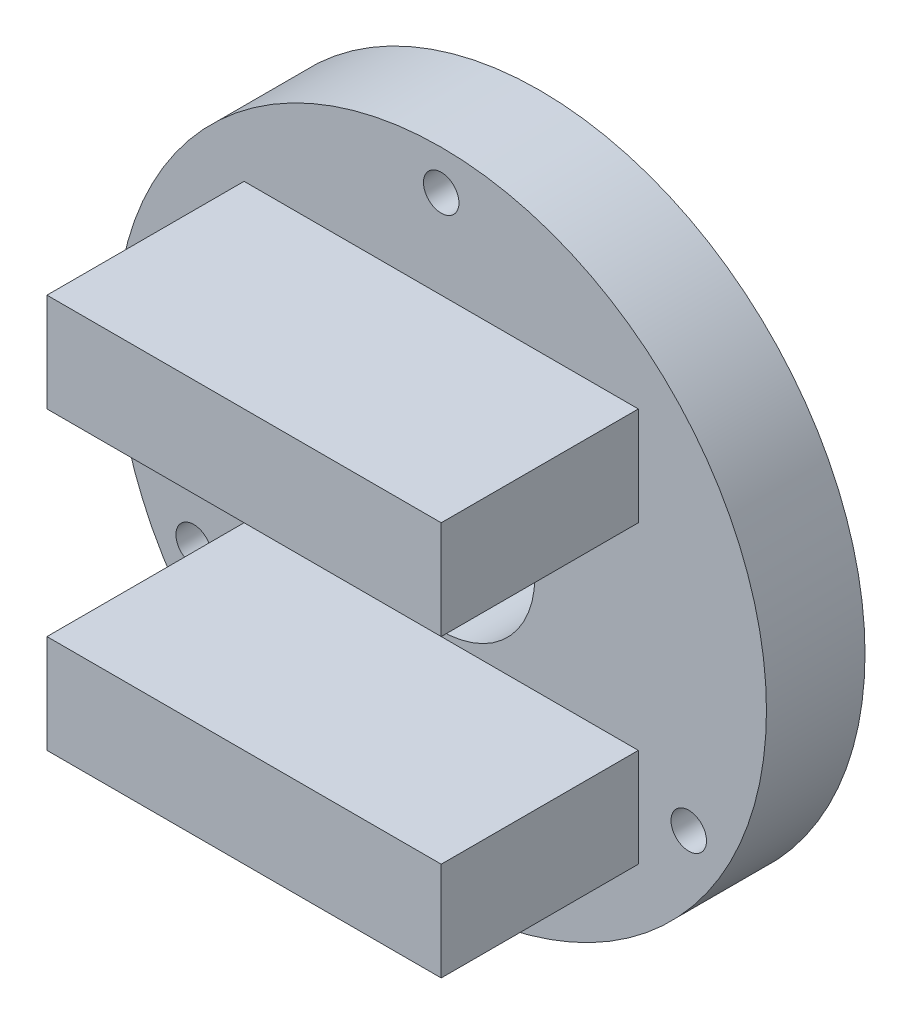
ISO-10303-21;
HEADER;
FILE_DESCRIPTION(('STEP AP214'),'2;1');
FILE_NAME('part.step','',(''),(''),'','','');
FILE_SCHEMA(('AUTOMOTIVE_DESIGN { 1 0 10303 214 1 1 1 1 }'));
ENDSEC;
DATA;
#1=APPLICATION_CONTEXT('core data for automotive mechanical design processes');
#2=APPLICATION_PROTOCOL_DEFINITION('international standard','automotive_design',2000,#1);
#3=PRODUCT_CONTEXT('',#1,'mechanical');
#4=PRODUCT('Part','Part','',(#3));
#5=PRODUCT_RELATED_PRODUCT_CATEGORY('part','',(#4));
#6=PRODUCT_DEFINITION_FORMATION('','',#4);
#7=PRODUCT_DEFINITION_CONTEXT('part definition',#1,'design');
#8=PRODUCT_DEFINITION('design','',#6,#7);
#9=PRODUCT_DEFINITION_SHAPE('','',#8);
#10=(LENGTH_UNIT() NAMED_UNIT(*) SI_UNIT(.MILLI.,.METRE.));
#11=(NAMED_UNIT(*) PLANE_ANGLE_UNIT() SI_UNIT($,.RADIAN.));
#12=(NAMED_UNIT(*) SI_UNIT($,.STERADIAN.) SOLID_ANGLE_UNIT());
#13=UNCERTAINTY_MEASURE_WITH_UNIT(LENGTH_MEASURE(1.E-05),#10,'distance_accuracy_value','');
#14=(GEOMETRIC_REPRESENTATION_CONTEXT(3) GLOBAL_UNCERTAINTY_ASSIGNED_CONTEXT((#13)) GLOBAL_UNIT_ASSIGNED_CONTEXT((#10,
#11,#12)) REPRESENTATION_CONTEXT('',''));
#15=CARTESIAN_POINT('',(0.,0.,0.));
#16=DIRECTION('',(0.,0.,1.));
#17=DIRECTION('',(1.,0.,0.));
#18=AXIS2_PLACEMENT_3D('',#15,#16,#17);
#19=CARTESIAN_POINT('',(0.,0.,10.));
#20=DIRECTION('',(0.,0.,1.));
#21=DIRECTION('',(1.,0.,0.));
#22=AXIS2_PLACEMENT_3D('',#19,#20,#21);
#23=PLANE('',#22);
#24=DIRECTION('',(0.,-1.,0.));
#25=VECTOR('',#24,1.);
#26=CARTESIAN_POINT('',(-20.,20.,10.));
#27=LINE('',#26,#25);
#28=CARTESIAN_POINT('',(-20.,20.,10.));
#29=VERTEX_POINT('',#28);
#30=CARTESIAN_POINT('',(-20.,10.,10.));
#31=VERTEX_POINT('',#30);
#32=EDGE_CURVE('E57',#29,#31,#27,.T.);
#33=ORIENTED_EDGE('',*,*,#32,.F.);
#34=DIRECTION('',(-1.,0.,0.));
#35=VECTOR('',#34,1.);
#36=CARTESIAN_POINT('',(-20.,20.,10.));
#37=LINE('',#36,#35);
#38=CARTESIAN_POINT('',(20.,20.,10.));
#39=VERTEX_POINT('',#38);
#40=EDGE_CURVE('E58',#39,#29,#37,.T.);
#41=ORIENTED_EDGE('',*,*,#40,.F.);
#42=DIRECTION('',(0.,1.,0.));
#43=VECTOR('',#42,1.);
#44=CARTESIAN_POINT('',(20.,20.,10.));
#45=LINE('',#44,#43);
#46=CARTESIAN_POINT('',(20.,10.,10.));
#47=VERTEX_POINT('',#46);
#48=EDGE_CURVE('E370',#47,#39,#45,.T.);
#49=ORIENTED_EDGE('',*,*,#48,.F.);
#50=DIRECTION('',(1.,0.,0.));
#51=VECTOR('',#50,1.);
#52=CARTESIAN_POINT('',(-20.,10.,10.));
#53=LINE('',#52,#51);
#54=EDGE_CURVE('E373',#31,#47,#53,.T.);
#55=ORIENTED_EDGE('',*,*,#54,.F.);
#56=EDGE_LOOP('',(#33,#41,#49,#55));
#57=FACE_BOUND('',#56,.T.);
#58=DIRECTION('',(0.,-1.,0.));
#59=VECTOR('',#58,1.);
#60=CARTESIAN_POINT('',(-20.,-10.,10.));
#61=LINE('',#60,#59);
#62=CARTESIAN_POINT('',(-20.,-10.,10.));
#63=VERTEX_POINT('',#62);
#64=CARTESIAN_POINT('',(-20.,-20.,10.));
#65=VERTEX_POINT('',#64);
#66=EDGE_CURVE('E158',#63,#65,#61,.T.);
#67=ORIENTED_EDGE('',*,*,#66,.F.);
#68=DIRECTION('',(-1.,0.,0.));
#69=VECTOR('',#68,1.);
#70=CARTESIAN_POINT('',(-20.,-10.,10.));
#71=LINE('',#70,#69);
#72=CARTESIAN_POINT('',(20.,-10.,10.));
#73=VERTEX_POINT('',#72);
#74=EDGE_CURVE('E146',#73,#63,#71,.T.);
#75=ORIENTED_EDGE('',*,*,#74,.F.);
#76=DIRECTION('',(0.,1.,0.));
#77=VECTOR('',#76,1.);
#78=CARTESIAN_POINT('',(20.,-10.,10.));
#79=LINE('',#78,#77);
#80=CARTESIAN_POINT('',(20.,-20.,10.));
#81=VERTEX_POINT('',#80);
#82=EDGE_CURVE('E151',#81,#73,#79,.T.);
#83=ORIENTED_EDGE('',*,*,#82,.F.);
#84=DIRECTION('',(1.,0.,0.));
#85=VECTOR('',#84,1.);
#86=CARTESIAN_POINT('',(-20.,-20.,10.));
#87=LINE('',#86,#85);
#88=EDGE_CURVE('E154',#65,#81,#87,.T.);
#89=ORIENTED_EDGE('',*,*,#88,.F.);
#90=EDGE_LOOP('',(#67,#75,#83,#89));
#91=FACE_BOUND('',#90,.T.);
#92=CARTESIAN_POINT('',(25.1147367097487,-14.5,10.));
#93=DIRECTION('',(0.,0.,1.));
#94=DIRECTION('',(1.,0.,0.));
#95=AXIS2_PLACEMENT_3D('',#92,#93,#94);
#96=CIRCLE('',#95,1.8);
#97=CARTESIAN_POINT('',(26.9147367097487,-14.5,10.));
#98=VERTEX_POINT('',#97);
#99=EDGE_CURVE('E171',#98,#98,#96,.T.);
#100=ORIENTED_EDGE('',*,*,#99,.F.);
#101=EDGE_LOOP('',(#100));
#102=FACE_BOUND('',#101,.T.);
#103=CARTESIAN_POINT('',(0.,29.,10.));
#104=DIRECTION('',(0.,0.,1.));
#105=DIRECTION('',(1.,0.,0.));
#106=AXIS2_PLACEMENT_3D('',#103,#104,#105);
#107=CIRCLE('',#106,1.8);
#108=CARTESIAN_POINT('',(1.8,29.,10.));
#109=VERTEX_POINT('',#108);
#110=EDGE_CURVE('E181',#109,#109,#107,.T.);
#111=ORIENTED_EDGE('',*,*,#110,.F.);
#112=EDGE_LOOP('',(#111));
#113=FACE_BOUND('',#112,.T.);
#114=CARTESIAN_POINT('',(0.,0.,10.));
#115=DIRECTION('',(0.,0.,1.));
#116=DIRECTION('',(1.,0.,0.));
#117=AXIS2_PLACEMENT_3D('',#114,#115,#116);
#118=CIRCLE('',#117,33.);
#119=CARTESIAN_POINT('',(33.,0.,10.));
#120=VERTEX_POINT('',#119);
#121=EDGE_CURVE('E11',#120,#120,#118,.T.);
#122=ORIENTED_EDGE('',*,*,#121,.T.);
#123=EDGE_LOOP('',(#122));
#124=FACE_BOUND('',#123,.T.);
#125=CARTESIAN_POINT('',(0.,0.,10.));
#126=DIRECTION('',(0.,0.,1.));
#127=DIRECTION('',(1.,0.,0.));
#128=AXIS2_PLACEMENT_3D('',#125,#126,#127);
#129=CIRCLE('',#128,9.5);
#130=CARTESIAN_POINT('',(9.5,0.,10.));
#131=VERTEX_POINT('',#130);
#132=EDGE_CURVE('E176',#131,#131,#129,.T.);
#133=ORIENTED_EDGE('',*,*,#132,.F.);
#134=EDGE_LOOP('',(#133));
#135=FACE_BOUND('',#134,.T.);
#136=CARTESIAN_POINT('',(-25.1147367097487,-14.5,10.));
#137=DIRECTION('',(0.,0.,1.));
#138=DIRECTION('',(1.,0.,0.));
#139=AXIS2_PLACEMENT_3D('',#136,#137,#138);
#140=CIRCLE('',#139,1.8);
#141=CARTESIAN_POINT('',(-23.3147367097487,-14.5,10.));
#142=VERTEX_POINT('',#141);
#143=EDGE_CURVE('E129',#142,#142,#140,.T.);
#144=ORIENTED_EDGE('',*,*,#143,.F.);
#145=EDGE_LOOP('',(#144));
#146=FACE_BOUND('',#145,.T.);
#147=ADVANCED_FACE('F41',(#57,#91,#102,#113,#124,#135,#146),#23,.T.);
#148=CARTESIAN_POINT('',(0.,0.,0.));
#149=DIRECTION('',(0.,0.,1.));
#150=DIRECTION('',(1.,0.,0.));
#151=AXIS2_PLACEMENT_3D('',#148,#149,#150);
#152=PLANE('',#151);
#153=CARTESIAN_POINT('',(0.,0.,0.));
#154=DIRECTION('',(0.,0.,1.));
#155=DIRECTION('',(1.,0.,0.));
#156=AXIS2_PLACEMENT_3D('',#153,#154,#155);
#157=CIRCLE('',#156,33.);
#158=CARTESIAN_POINT('',(33.,0.,0.));
#159=VERTEX_POINT('',#158);
#160=EDGE_CURVE('E44',#159,#159,#157,.T.);
#161=ORIENTED_EDGE('',*,*,#160,.F.);
#162=EDGE_LOOP('',(#161));
#163=FACE_BOUND('',#162,.T.);
#164=CARTESIAN_POINT('',(0.,29.,0.));
#165=DIRECTION('',(0.,0.,1.));
#166=DIRECTION('',(1.,0.,0.));
#167=AXIS2_PLACEMENT_3D('',#164,#165,#166);
#168=CIRCLE('',#167,1.8);
#169=CARTESIAN_POINT('',(1.8,29.,0.));
#170=VERTEX_POINT('',#169);
#171=EDGE_CURVE('E177',#170,#170,#168,.T.);
#172=ORIENTED_EDGE('',*,*,#171,.T.);
#173=EDGE_LOOP('',(#172));
#174=FACE_BOUND('',#173,.T.);
#175=CARTESIAN_POINT('',(0.,0.,0.));
#176=DIRECTION('',(0.,0.,1.));
#177=DIRECTION('',(1.,0.,0.));
#178=AXIS2_PLACEMENT_3D('',#175,#176,#177);
#179=CIRCLE('',#178,9.5);
#180=CARTESIAN_POINT('',(9.5,0.,0.));
#181=VERTEX_POINT('',#180);
#182=EDGE_CURVE('E173',#181,#181,#179,.T.);
#183=ORIENTED_EDGE('',*,*,#182,.T.);
#184=EDGE_LOOP('',(#183));
#185=FACE_BOUND('',#184,.T.);
#186=CARTESIAN_POINT('',(25.1147367097487,-14.5,0.));
#187=DIRECTION('',(0.,0.,1.));
#188=DIRECTION('',(1.,0.,0.));
#189=AXIS2_PLACEMENT_3D('',#186,#187,#188);
#190=CIRCLE('',#189,1.8);
#191=CARTESIAN_POINT('',(26.9147367097487,-14.5,0.));
#192=VERTEX_POINT('',#191);
#193=EDGE_CURVE('E166',#192,#192,#190,.T.);
#194=ORIENTED_EDGE('',*,*,#193,.T.);
#195=EDGE_LOOP('',(#194));
#196=FACE_BOUND('',#195,.T.);
#197=CARTESIAN_POINT('',(-25.1147367097487,-14.5,0.));
#198=DIRECTION('',(0.,0.,1.));
#199=DIRECTION('',(1.,0.,0.));
#200=AXIS2_PLACEMENT_3D('',#197,#198,#199);
#201=CIRCLE('',#200,1.8);
#202=CARTESIAN_POINT('',(-23.3147367097487,-14.5,0.));
#203=VERTEX_POINT('',#202);
#204=EDGE_CURVE('E127',#203,#203,#201,.T.);
#205=ORIENTED_EDGE('',*,*,#204,.T.);
#206=EDGE_LOOP('',(#205));
#207=FACE_BOUND('',#206,.T.);
#208=ADVANCED_FACE('F188',(#163,#174,#185,#196,#207),#152,.F.);
#209=CARTESIAN_POINT('',(0.,0.,10.));
#210=DIRECTION('',(0.,0.,-1.));
#211=DIRECTION('',(-1.,0.,0.));
#212=AXIS2_PLACEMENT_3D('',#209,#210,#211);
#213=CYLINDRICAL_SURFACE('',#212,33.);
#214=ORIENTED_EDGE('',*,*,#121,.F.);
#215=EDGE_LOOP('',(#214));
#216=FACE_BOUND('',#215,.T.);
#217=ORIENTED_EDGE('',*,*,#160,.T.);
#218=EDGE_LOOP('',(#217));
#219=FACE_BOUND('',#218,.T.);
#220=ADVANCED_FACE('F43',(#216,#219),#213,.T.);
#221=CARTESIAN_POINT('',(0.,29.,10.));
#222=DIRECTION('',(0.,0.,-1.));
#223=DIRECTION('',(-1.,0.,0.));
#224=AXIS2_PLACEMENT_3D('',#221,#222,#223);
#225=CYLINDRICAL_SURFACE('',#224,1.8);
#226=ORIENTED_EDGE('',*,*,#110,.T.);
#227=EDGE_LOOP('',(#226));
#228=FACE_BOUND('',#227,.T.);
#229=ORIENTED_EDGE('',*,*,#171,.F.);
#230=EDGE_LOOP('',(#229));
#231=FACE_BOUND('',#230,.T.);
#232=ADVANCED_FACE('F191',(#228,#231),#225,.F.);
#233=CARTESIAN_POINT('',(0.,0.,10.));
#234=DIRECTION('',(0.,0.,-1.));
#235=DIRECTION('',(-1.,0.,0.));
#236=AXIS2_PLACEMENT_3D('',#233,#234,#235);
#237=CYLINDRICAL_SURFACE('',#236,9.5);
#238=ORIENTED_EDGE('',*,*,#132,.T.);
#239=EDGE_LOOP('',(#238));
#240=FACE_BOUND('',#239,.T.);
#241=ORIENTED_EDGE('',*,*,#182,.F.);
#242=EDGE_LOOP('',(#241));
#243=FACE_BOUND('',#242,.T.);
#244=ADVANCED_FACE('F193',(#240,#243),#237,.F.);
#245=CARTESIAN_POINT('',(25.1147367097487,-14.5,10.));
#246=DIRECTION('',(0.,0.,-1.));
#247=DIRECTION('',(-1.,0.,0.));
#248=AXIS2_PLACEMENT_3D('',#245,#246,#247);
#249=CYLINDRICAL_SURFACE('',#248,1.8);
#250=ORIENTED_EDGE('',*,*,#99,.T.);
#251=EDGE_LOOP('',(#250));
#252=FACE_BOUND('',#251,.T.);
#253=ORIENTED_EDGE('',*,*,#193,.F.);
#254=EDGE_LOOP('',(#253));
#255=FACE_BOUND('',#254,.T.);
#256=ADVANCED_FACE('F203',(#252,#255),#249,.F.);
#257=CARTESIAN_POINT('',(-25.1147367097487,-14.5,10.));
#258=DIRECTION('',(0.,0.,-1.));
#259=DIRECTION('',(-1.,0.,0.));
#260=AXIS2_PLACEMENT_3D('',#257,#258,#259);
#261=CYLINDRICAL_SURFACE('',#260,1.8);
#262=ORIENTED_EDGE('',*,*,#143,.T.);
#263=EDGE_LOOP('',(#262));
#264=FACE_BOUND('',#263,.T.);
#265=ORIENTED_EDGE('',*,*,#204,.F.);
#266=EDGE_LOOP('',(#265));
#267=FACE_BOUND('',#266,.T.);
#268=ADVANCED_FACE('F223',(#264,#267),#261,.F.);
#269=CARTESIAN_POINT('',(-20.,-10.,30.));
#270=DIRECTION('',(1.,0.,0.));
#271=DIRECTION('',(0.,0.,-1.));
#272=AXIS2_PLACEMENT_3D('',#269,#270,#271);
#273=PLANE('',#272);
#274=ORIENTED_EDGE('',*,*,#66,.T.);
#275=DIRECTION('',(0.,0.,-1.));
#276=VECTOR('',#275,1.);
#277=CARTESIAN_POINT('',(-20.,-20.,30.));
#278=LINE('',#277,#276);
#279=CARTESIAN_POINT('',(-20.,-20.,30.));
#280=VERTEX_POINT('',#279);
#281=EDGE_CURVE('E135',#280,#65,#278,.T.);
#282=ORIENTED_EDGE('',*,*,#281,.F.);
#283=DIRECTION('',(0.,-1.,0.));
#284=VECTOR('',#283,1.);
#285=CARTESIAN_POINT('',(-20.,-10.,30.));
#286=LINE('',#285,#284);
#287=CARTESIAN_POINT('',(-20.,-10.,30.));
#288=VERTEX_POINT('',#287);
#289=EDGE_CURVE('E155',#288,#280,#286,.T.);
#290=ORIENTED_EDGE('',*,*,#289,.F.);
#291=DIRECTION('',(0.,0.,-1.));
#292=VECTOR('',#291,1.);
#293=CARTESIAN_POINT('',(-20.,-10.,30.));
#294=LINE('',#293,#292);
#295=EDGE_CURVE('E145',#288,#63,#294,.T.);
#296=ORIENTED_EDGE('',*,*,#295,.T.);
#297=EDGE_LOOP('',(#274,#282,#290,#296));
#298=FACE_BOUND('',#297,.T.);
#299=ADVANCED_FACE('F227',(#298),#273,.F.);
#300=CARTESIAN_POINT('',(-20.,-20.,30.));
#301=DIRECTION('',(0.,1.,0.));
#302=DIRECTION('',(-1.,0.,0.));
#303=AXIS2_PLACEMENT_3D('',#300,#301,#302);
#304=PLANE('',#303);
#305=ORIENTED_EDGE('',*,*,#88,.T.);
#306=DIRECTION('',(0.,0.,-1.));
#307=VECTOR('',#306,1.);
#308=CARTESIAN_POINT('',(20.,-20.,30.));
#309=LINE('',#308,#307);
#310=CARTESIAN_POINT('',(20.,-20.,30.));
#311=VERTEX_POINT('',#310);
#312=EDGE_CURVE('E140',#311,#81,#309,.T.);
#313=ORIENTED_EDGE('',*,*,#312,.F.);
#314=DIRECTION('',(1.,0.,0.));
#315=VECTOR('',#314,1.);
#316=CARTESIAN_POINT('',(-20.,-20.,30.));
#317=LINE('',#316,#315);
#318=EDGE_CURVE('E163',#280,#311,#317,.T.);
#319=ORIENTED_EDGE('',*,*,#318,.F.);
#320=ORIENTED_EDGE('',*,*,#281,.T.);
#321=EDGE_LOOP('',(#305,#313,#319,#320));
#322=FACE_BOUND('',#321,.T.);
#323=ADVANCED_FACE('F233',(#322),#304,.F.);
#324=CARTESIAN_POINT('',(20.,-10.,30.));
#325=DIRECTION('',(-1.,0.,0.));
#326=DIRECTION('',(0.,0.,1.));
#327=AXIS2_PLACEMENT_3D('',#324,#325,#326);
#328=PLANE('',#327);
#329=ORIENTED_EDGE('',*,*,#82,.T.);
#330=DIRECTION('',(0.,0.,-1.));
#331=VECTOR('',#330,1.);
#332=CARTESIAN_POINT('',(20.,-10.,30.));
#333=LINE('',#332,#331);
#334=CARTESIAN_POINT('',(20.,-10.,30.));
#335=VERTEX_POINT('',#334);
#336=EDGE_CURVE('E143',#335,#73,#333,.T.);
#337=ORIENTED_EDGE('',*,*,#336,.F.);
#338=DIRECTION('',(0.,1.,0.));
#339=VECTOR('',#338,1.);
#340=CARTESIAN_POINT('',(20.,-10.,30.));
#341=LINE('',#340,#339);
#342=EDGE_CURVE('E165',#311,#335,#341,.T.);
#343=ORIENTED_EDGE('',*,*,#342,.F.);
#344=ORIENTED_EDGE('',*,*,#312,.T.);
#345=EDGE_LOOP('',(#329,#337,#343,#344));
#346=FACE_BOUND('',#345,.T.);
#347=ADVANCED_FACE('F246',(#346),#328,.F.);
#348=CARTESIAN_POINT('',(-20.,-10.,30.));
#349=DIRECTION('',(0.,-1.,0.));
#350=DIRECTION('',(0.,0.,-1.));
#351=AXIS2_PLACEMENT_3D('',#348,#349,#350);
#352=PLANE('',#351);
#353=ORIENTED_EDGE('',*,*,#74,.T.);
#354=ORIENTED_EDGE('',*,*,#295,.F.);
#355=DIRECTION('',(-1.,0.,0.));
#356=VECTOR('',#355,1.);
#357=CARTESIAN_POINT('',(-20.,-10.,30.));
#358=LINE('',#357,#356);
#359=EDGE_CURVE('E150',#335,#288,#358,.T.);
#360=ORIENTED_EDGE('',*,*,#359,.F.);
#361=ORIENTED_EDGE('',*,*,#336,.T.);
#362=EDGE_LOOP('',(#353,#354,#360,#361));
#363=FACE_BOUND('',#362,.T.);
#364=ADVANCED_FACE('F244',(#363),#352,.F.);
#365=CARTESIAN_POINT('',(0.,0.,30.));
#366=DIRECTION('',(0.,0.,1.));
#367=DIRECTION('',(1.,0.,0.));
#368=AXIS2_PLACEMENT_3D('',#365,#366,#367);
#369=PLANE('',#368);
#370=ORIENTED_EDGE('',*,*,#289,.T.);
#371=ORIENTED_EDGE('',*,*,#318,.T.);
#372=ORIENTED_EDGE('',*,*,#342,.T.);
#373=ORIENTED_EDGE('',*,*,#359,.T.);
#374=EDGE_LOOP('',(#370,#371,#372,#373));
#375=FACE_BOUND('',#374,.T.);
#376=ADVANCED_FACE('F238',(#375),#369,.T.);
#377=CARTESIAN_POINT('',(-20.,20.,30.));
#378=DIRECTION('',(1.,0.,0.));
#379=DIRECTION('',(0.,0.,-1.));
#380=AXIS2_PLACEMENT_3D('',#377,#378,#379);
#381=PLANE('',#380);
#382=ORIENTED_EDGE('',*,*,#32,.T.);
#383=DIRECTION('',(0.,0.,-1.));
#384=VECTOR('',#383,1.);
#385=CARTESIAN_POINT('',(-20.,10.,30.));
#386=LINE('',#385,#384);
#387=CARTESIAN_POINT('',(-20.,10.,30.));
#388=VERTEX_POINT('',#387);
#389=EDGE_CURVE('E108',#388,#31,#386,.T.);
#390=ORIENTED_EDGE('',*,*,#389,.F.);
#391=DIRECTION('',(0.,-1.,0.));
#392=VECTOR('',#391,1.);
#393=CARTESIAN_POINT('',(-20.,20.,30.));
#394=LINE('',#393,#392);
#395=CARTESIAN_POINT('',(-20.,20.,30.));
#396=VERTEX_POINT('',#395);
#397=EDGE_CURVE('E113',#396,#388,#394,.T.);
#398=ORIENTED_EDGE('',*,*,#397,.F.);
#399=DIRECTION('',(0.,0.,-1.));
#400=VECTOR('',#399,1.);
#401=CARTESIAN_POINT('',(-20.,20.,30.));
#402=LINE('',#401,#400);
#403=EDGE_CURVE('E364',#396,#29,#402,.T.);
#404=ORIENTED_EDGE('',*,*,#403,.T.);
#405=EDGE_LOOP('',(#382,#390,#398,#404));
#406=FACE_BOUND('',#405,.T.);
#407=ADVANCED_FACE('F122',(#406),#381,.F.);
#408=CARTESIAN_POINT('',(-20.,10.,30.));
#409=DIRECTION('',(0.,1.,0.));
#410=DIRECTION('',(0.,0.,1.));
#411=AXIS2_PLACEMENT_3D('',#408,#409,#410);
#412=PLANE('',#411);
#413=ORIENTED_EDGE('',*,*,#54,.T.);
#414=DIRECTION('',(0.,0.,-1.));
#415=VECTOR('',#414,1.);
#416=CARTESIAN_POINT('',(20.,10.,30.));
#417=LINE('',#416,#415);
#418=CARTESIAN_POINT('',(20.,10.,30.));
#419=VERTEX_POINT('',#418);
#420=EDGE_CURVE('E112',#419,#47,#417,.T.);
#421=ORIENTED_EDGE('',*,*,#420,.F.);
#422=DIRECTION('',(1.,0.,0.));
#423=VECTOR('',#422,1.);
#424=CARTESIAN_POINT('',(-20.,10.,30.));
#425=LINE('',#424,#423);
#426=EDGE_CURVE('E102',#388,#419,#425,.T.);
#427=ORIENTED_EDGE('',*,*,#426,.F.);
#428=ORIENTED_EDGE('',*,*,#389,.T.);
#429=EDGE_LOOP('',(#413,#421,#427,#428));
#430=FACE_BOUND('',#429,.T.);
#431=ADVANCED_FACE('F110',(#430),#412,.F.);
#432=CARTESIAN_POINT('',(20.,20.,30.));
#433=DIRECTION('',(-1.,0.,0.));
#434=DIRECTION('',(0.,-1.,0.));
#435=AXIS2_PLACEMENT_3D('',#432,#433,#434);
#436=PLANE('',#435);
#437=ORIENTED_EDGE('',*,*,#48,.T.);
#438=DIRECTION('',(0.,0.,-1.));
#439=VECTOR('',#438,1.);
#440=CARTESIAN_POINT('',(20.,20.,30.));
#441=LINE('',#440,#439);
#442=CARTESIAN_POINT('',(20.,20.,30.));
#443=VERTEX_POINT('',#442);
#444=EDGE_CURVE('E131',#443,#39,#441,.T.);
#445=ORIENTED_EDGE('',*,*,#444,.F.);
#446=DIRECTION('',(0.,1.,0.));
#447=VECTOR('',#446,1.);
#448=CARTESIAN_POINT('',(20.,20.,30.));
#449=LINE('',#448,#447);
#450=EDGE_CURVE('E111',#419,#443,#449,.T.);
#451=ORIENTED_EDGE('',*,*,#450,.F.);
#452=ORIENTED_EDGE('',*,*,#420,.T.);
#453=EDGE_LOOP('',(#437,#445,#451,#452));
#454=FACE_BOUND('',#453,.T.);
#455=ADVANCED_FACE('F259',(#454),#436,.F.);
#456=CARTESIAN_POINT('',(-20.,20.,30.));
#457=DIRECTION('',(0.,-1.,0.));
#458=DIRECTION('',(1.,0.,0.));
#459=AXIS2_PLACEMENT_3D('',#456,#457,#458);
#460=PLANE('',#459);
#461=ORIENTED_EDGE('',*,*,#40,.T.);
#462=ORIENTED_EDGE('',*,*,#403,.F.);
#463=DIRECTION('',(-1.,0.,0.));
#464=VECTOR('',#463,1.);
#465=CARTESIAN_POINT('',(-20.,20.,30.));
#466=LINE('',#465,#464);
#467=EDGE_CURVE('E120',#443,#396,#466,.T.);
#468=ORIENTED_EDGE('',*,*,#467,.F.);
#469=ORIENTED_EDGE('',*,*,#444,.T.);
#470=EDGE_LOOP('',(#461,#462,#468,#469));
#471=FACE_BOUND('',#470,.T.);
#472=ADVANCED_FACE('F265',(#471),#460,.F.);
#473=CARTESIAN_POINT('',(0.,0.,30.));
#474=DIRECTION('',(0.,0.,1.));
#475=DIRECTION('',(1.,0.,0.));
#476=AXIS2_PLACEMENT_3D('',#473,#474,#475);
#477=PLANE('',#476);
#478=ORIENTED_EDGE('',*,*,#397,.T.);
#479=ORIENTED_EDGE('',*,*,#426,.T.);
#480=ORIENTED_EDGE('',*,*,#450,.T.);
#481=ORIENTED_EDGE('',*,*,#467,.T.);
#482=EDGE_LOOP('',(#478,#479,#480,#481));
#483=FACE_BOUND('',#482,.T.);
#484=ADVANCED_FACE('F119',(#483),#477,.T.);
#485=CLOSED_SHELL('',(#147,#208,#220,#232,#244,#256,#268,#299,#323,#347,#364,#376,#407,#431,
#455,#472,#484));
#486=MANIFOLD_SOLID_BREP('B2',#485);
#487=ADVANCED_BREP_SHAPE_REPRESENTATION('',(#18,#486),#14);
#488=SHAPE_DEFINITION_REPRESENTATION(#9,#487);
ENDSEC;
END-ISO-10303-21;
